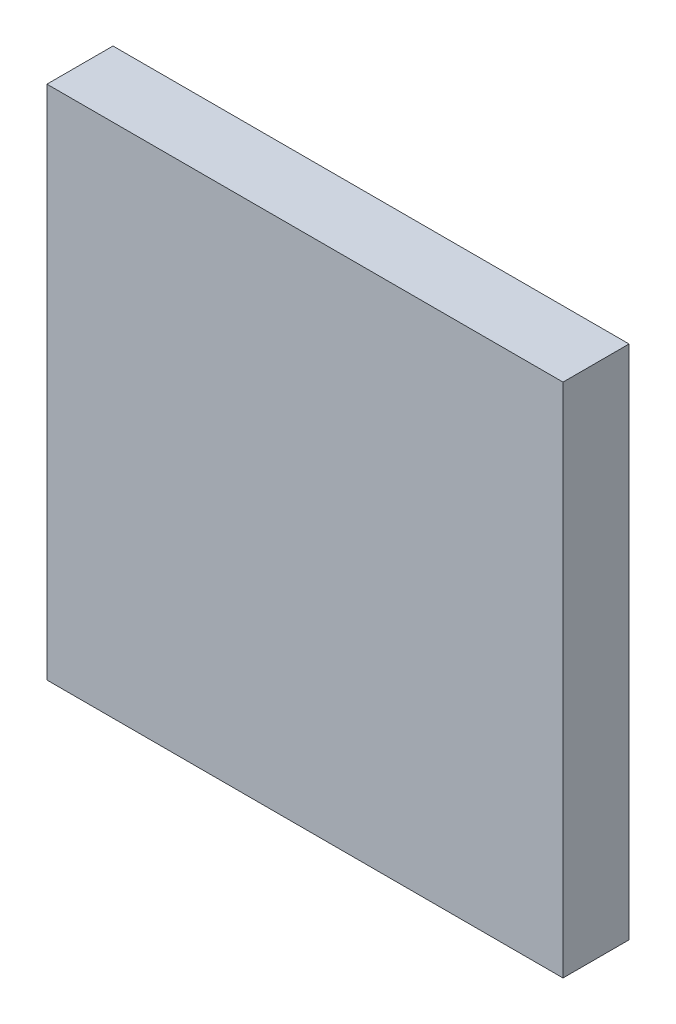
ISO-10303-21;
HEADER;
FILE_DESCRIPTION(('STEP AP214'),'2;1');
FILE_NAME('part.step','',(''),(''),'','','');
FILE_SCHEMA(('AUTOMOTIVE_DESIGN { 1 0 10303 214 1 1 1 1 }'));
ENDSEC;
DATA;
#1=APPLICATION_CONTEXT('core data for automotive mechanical design processes');
#2=APPLICATION_PROTOCOL_DEFINITION('international standard','automotive_design',2000,#1);
#3=PRODUCT_CONTEXT('',#1,'mechanical');
#4=PRODUCT('Part','Part','',(#3));
#5=PRODUCT_RELATED_PRODUCT_CATEGORY('part','',(#4));
#6=PRODUCT_DEFINITION_FORMATION('','',#4);
#7=PRODUCT_DEFINITION_CONTEXT('part definition',#1,'design');
#8=PRODUCT_DEFINITION('design','',#6,#7);
#9=PRODUCT_DEFINITION_SHAPE('','',#8);
#10=(LENGTH_UNIT() NAMED_UNIT(*) SI_UNIT(.MILLI.,.METRE.));
#11=(NAMED_UNIT(*) PLANE_ANGLE_UNIT() SI_UNIT($,.RADIAN.));
#12=(NAMED_UNIT(*) SI_UNIT($,.STERADIAN.) SOLID_ANGLE_UNIT());
#13=UNCERTAINTY_MEASURE_WITH_UNIT(LENGTH_MEASURE(1.E-05),#10,'distance_accuracy_value','');
#14=(GEOMETRIC_REPRESENTATION_CONTEXT(3) GLOBAL_UNCERTAINTY_ASSIGNED_CONTEXT((#13)) GLOBAL_UNIT_ASSIGNED_CONTEXT((#10,
#11,#12)) REPRESENTATION_CONTEXT('',''));
#15=CARTESIAN_POINT('',(0.,0.,0.));
#16=DIRECTION('',(0.,0.,1.));
#17=DIRECTION('',(1.,0.,0.));
#18=AXIS2_PLACEMENT_3D('',#15,#16,#17);
#19=CARTESIAN_POINT('',(0.,0.,16.));
#20=DIRECTION('',(1.,0.,0.));
#21=DIRECTION('',(0.,0.,-1.));
#22=AXIS2_PLACEMENT_3D('',#19,#20,#21);
#23=PLANE('',#22);
#24=DIRECTION('',(0.,-1.,0.));
#25=VECTOR('',#24,1.);
#26=CARTESIAN_POINT('',(0.,0.,0.));
#27=LINE('',#26,#25);
#28=CARTESIAN_POINT('',(0.,125.,0.));
#29=VERTEX_POINT('',#28);
#30=CARTESIAN_POINT('',(0.,0.,0.));
#31=VERTEX_POINT('',#30);
#32=EDGE_CURVE('E96',#29,#31,#27,.T.);
#33=ORIENTED_EDGE('',*,*,#32,.T.);
#34=DIRECTION('',(0.,0.,-1.));
#35=VECTOR('',#34,1.);
#36=CARTESIAN_POINT('',(0.,0.,16.));
#37=LINE('',#36,#35);
#38=CARTESIAN_POINT('',(0.,0.,16.));
#39=VERTEX_POINT('',#38);
#40=EDGE_CURVE('E11',#39,#31,#37,.T.);
#41=ORIENTED_EDGE('',*,*,#40,.F.);
#42=DIRECTION('',(0.,-1.,0.));
#43=VECTOR('',#42,1.);
#44=CARTESIAN_POINT('',(0.,0.,16.));
#45=LINE('',#44,#43);
#46=CARTESIAN_POINT('',(0.,125.,16.));
#47=VERTEX_POINT('',#46);
#48=EDGE_CURVE('E84',#47,#39,#45,.T.);
#49=ORIENTED_EDGE('',*,*,#48,.F.);
#50=DIRECTION('',(0.,0.,-1.));
#51=VECTOR('',#50,1.);
#52=CARTESIAN_POINT('',(0.,125.,16.));
#53=LINE('',#52,#51);
#54=EDGE_CURVE('E92',#47,#29,#53,.T.);
#55=ORIENTED_EDGE('',*,*,#54,.T.);
#56=EDGE_LOOP('',(#33,#41,#49,#55));
#57=FACE_BOUND('',#56,.T.);
#58=ADVANCED_FACE('F33',(#57),#23,.F.);
#59=CARTESIAN_POINT('',(0.,0.,16.));
#60=DIRECTION('',(0.,1.,0.));
#61=DIRECTION('',(0.,0.,1.));
#62=AXIS2_PLACEMENT_3D('',#59,#60,#61);
#63=PLANE('',#62);
#64=DIRECTION('',(1.,0.,0.));
#65=VECTOR('',#64,1.);
#66=CARTESIAN_POINT('',(0.,0.,0.));
#67=LINE('',#66,#65);
#68=CARTESIAN_POINT('',(125.,0.,0.));
#69=VERTEX_POINT('',#68);
#70=EDGE_CURVE('E88',#31,#69,#67,.T.);
#71=ORIENTED_EDGE('',*,*,#70,.T.);
#72=DIRECTION('',(0.,0.,-1.));
#73=VECTOR('',#72,1.);
#74=CARTESIAN_POINT('',(125.,0.,16.));
#75=LINE('',#74,#73);
#76=CARTESIAN_POINT('',(125.,0.,16.));
#77=VERTEX_POINT('',#76);
#78=EDGE_CURVE('E41',#77,#69,#75,.T.);
#79=ORIENTED_EDGE('',*,*,#78,.F.);
#80=DIRECTION('',(1.,0.,0.));
#81=VECTOR('',#80,1.);
#82=CARTESIAN_POINT('',(0.,0.,16.));
#83=LINE('',#82,#81);
#84=EDGE_CURVE('E79',#39,#77,#83,.T.);
#85=ORIENTED_EDGE('',*,*,#84,.F.);
#86=ORIENTED_EDGE('',*,*,#40,.T.);
#87=EDGE_LOOP('',(#71,#79,#85,#86));
#88=FACE_BOUND('',#87,.T.);
#89=ADVANCED_FACE('F87',(#88),#63,.F.);
#90=CARTESIAN_POINT('',(125.,0.,16.));
#91=DIRECTION('',(-1.,0.,0.));
#92=DIRECTION('',(0.,0.,1.));
#93=AXIS2_PLACEMENT_3D('',#90,#91,#92);
#94=PLANE('',#93);
#95=DIRECTION('',(0.,1.,0.));
#96=VECTOR('',#95,1.);
#97=CARTESIAN_POINT('',(125.,0.,0.));
#98=LINE('',#97,#96);
#99=CARTESIAN_POINT('',(125.,125.,0.));
#100=VERTEX_POINT('',#99);
#101=EDGE_CURVE('E66',#69,#100,#98,.T.);
#102=ORIENTED_EDGE('',*,*,#101,.T.);
#103=DIRECTION('',(0.,0.,-1.));
#104=VECTOR('',#103,1.);
#105=CARTESIAN_POINT('',(125.,125.,16.));
#106=LINE('',#105,#104);
#107=CARTESIAN_POINT('',(125.,125.,16.));
#108=VERTEX_POINT('',#107);
#109=EDGE_CURVE('E89',#108,#100,#106,.T.);
#110=ORIENTED_EDGE('',*,*,#109,.F.);
#111=DIRECTION('',(0.,1.,0.));
#112=VECTOR('',#111,1.);
#113=CARTESIAN_POINT('',(125.,0.,16.));
#114=LINE('',#113,#112);
#115=EDGE_CURVE('E82',#77,#108,#114,.T.);
#116=ORIENTED_EDGE('',*,*,#115,.F.);
#117=ORIENTED_EDGE('',*,*,#78,.T.);
#118=EDGE_LOOP('',(#102,#110,#116,#117));
#119=FACE_BOUND('',#118,.T.);
#120=ADVANCED_FACE('F90',(#119),#94,.F.);
#121=CARTESIAN_POINT('',(0.,125.,16.));
#122=DIRECTION('',(0.,-1.,0.));
#123=DIRECTION('',(0.,0.,-1.));
#124=AXIS2_PLACEMENT_3D('',#121,#122,#123);
#125=PLANE('',#124);
#126=DIRECTION('',(-1.,0.,0.));
#127=VECTOR('',#126,1.);
#128=CARTESIAN_POINT('',(0.,125.,0.));
#129=LINE('',#128,#127);
#130=EDGE_CURVE('E72',#100,#29,#129,.T.);
#131=ORIENTED_EDGE('',*,*,#130,.T.);
#132=ORIENTED_EDGE('',*,*,#54,.F.);
#133=DIRECTION('',(-1.,0.,0.));
#134=VECTOR('',#133,1.);
#135=CARTESIAN_POINT('',(0.,125.,16.));
#136=LINE('',#135,#134);
#137=EDGE_CURVE('E49',#108,#47,#136,.T.);
#138=ORIENTED_EDGE('',*,*,#137,.F.);
#139=ORIENTED_EDGE('',*,*,#109,.T.);
#140=EDGE_LOOP('',(#131,#132,#138,#139));
#141=FACE_BOUND('',#140,.T.);
#142=ADVANCED_FACE('F103',(#141),#125,.F.);
#143=CARTESIAN_POINT('',(0.,0.,16.));
#144=DIRECTION('',(0.,0.,-1.));
#145=DIRECTION('',(-1.,0.,0.));
#146=AXIS2_PLACEMENT_3D('',#143,#144,#145);
#147=PLANE('',#146);
#148=ORIENTED_EDGE('',*,*,#48,.T.);
#149=ORIENTED_EDGE('',*,*,#84,.T.);
#150=ORIENTED_EDGE('',*,*,#115,.T.);
#151=ORIENTED_EDGE('',*,*,#137,.T.);
#152=EDGE_LOOP('',(#148,#149,#150,#151));
#153=FACE_BOUND('',#152,.T.);
#154=ADVANCED_FACE('F80',(#153),#147,.F.);
#155=CARTESIAN_POINT('',(0.,0.,0.));
#156=DIRECTION('',(0.,0.,-1.));
#157=DIRECTION('',(-1.,0.,0.));
#158=AXIS2_PLACEMENT_3D('',#155,#156,#157);
#159=PLANE('',#158);
#160=ORIENTED_EDGE('',*,*,#32,.F.);
#161=ORIENTED_EDGE('',*,*,#130,.F.);
#162=ORIENTED_EDGE('',*,*,#101,.F.);
#163=ORIENTED_EDGE('',*,*,#70,.F.);
#164=EDGE_LOOP('',(#160,#161,#162,#163));
#165=FACE_BOUND('',#164,.T.);
#166=ADVANCED_FACE('F106',(#165),#159,.T.);
#167=CLOSED_SHELL('',(#58,#89,#120,#142,#154,#166));
#168=MANIFOLD_SOLID_BREP('B2',#167);
#169=ADVANCED_BREP_SHAPE_REPRESENTATION('',(#18,#168),#14);
#170=SHAPE_DEFINITION_REPRESENTATION(#9,#169);
ENDSEC;
END-ISO-10303-21;
